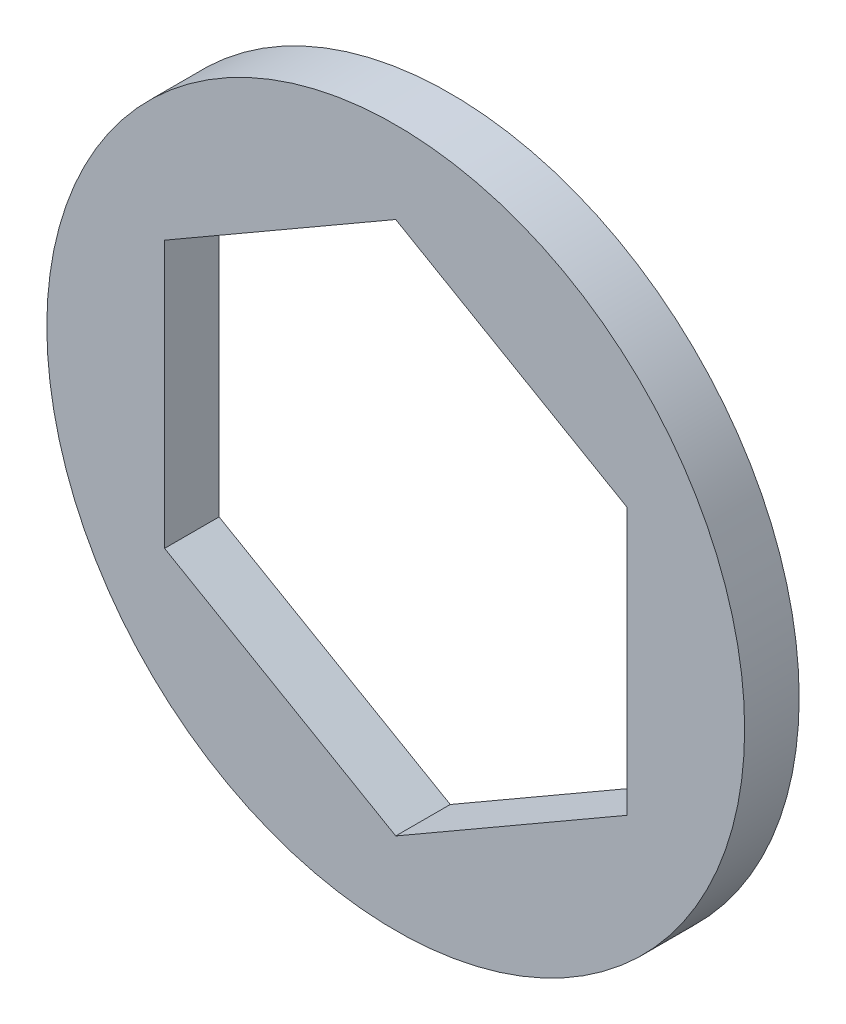
ISO-10303-21;
HEADER;
FILE_DESCRIPTION(('STEP AP214'),'2;1');
FILE_NAME('part.step','',(''),(''),'','','');
FILE_SCHEMA(('AUTOMOTIVE_DESIGN { 1 0 10303 214 1 1 1 1 }'));
ENDSEC;
DATA;
#1=APPLICATION_CONTEXT('core data for automotive mechanical design processes');
#2=APPLICATION_PROTOCOL_DEFINITION('international standard','automotive_design',2000,#1);
#3=PRODUCT_CONTEXT('',#1,'mechanical');
#4=PRODUCT('Part','Part','',(#3));
#5=PRODUCT_RELATED_PRODUCT_CATEGORY('part','',(#4));
#6=PRODUCT_DEFINITION_FORMATION('','',#4);
#7=PRODUCT_DEFINITION_CONTEXT('part definition',#1,'design');
#8=PRODUCT_DEFINITION('design','',#6,#7);
#9=PRODUCT_DEFINITION_SHAPE('','',#8);
#10=(LENGTH_UNIT() NAMED_UNIT(*) SI_UNIT(.MILLI.,.METRE.));
#11=(NAMED_UNIT(*) PLANE_ANGLE_UNIT() SI_UNIT($,.RADIAN.));
#12=(NAMED_UNIT(*) SI_UNIT($,.STERADIAN.) SOLID_ANGLE_UNIT());
#13=UNCERTAINTY_MEASURE_WITH_UNIT(LENGTH_MEASURE(1.E-05),#10,'distance_accuracy_value','');
#14=(GEOMETRIC_REPRESENTATION_CONTEXT(3) GLOBAL_UNCERTAINTY_ASSIGNED_CONTEXT((#13)) GLOBAL_UNIT_ASSIGNED_CONTEXT((#10,
#11,#12)) REPRESENTATION_CONTEXT('',''));
#15=CARTESIAN_POINT('',(0.,0.,0.));
#16=DIRECTION('',(0.,0.,1.));
#17=DIRECTION('',(1.,0.,0.));
#18=AXIS2_PLACEMENT_3D('',#15,#16,#17);
#19=CARTESIAN_POINT('',(0.,0.,0.79375));
#20=DIRECTION('',(0.,0.,1.));
#21=DIRECTION('',(1.,0.,0.));
#22=AXIS2_PLACEMENT_3D('',#19,#20,#21);
#23=PLANE('',#22);
#24=CARTESIAN_POINT('',(0.,0.,0.79375));
#25=DIRECTION('',(0.,0.,1.));
#26=DIRECTION('',(1.,0.,0.));
#27=AXIS2_PLACEMENT_3D('',#24,#25,#26);
#28=CIRCLE('',#27,10.16);
#29=CARTESIAN_POINT('',(10.16,0.,0.79375));
#30=VERTEX_POINT('',#29);
#31=EDGE_CURVE('E11',#30,#30,#28,.T.);
#32=ORIENTED_EDGE('',*,*,#31,.T.);
#33=EDGE_LOOP('',(#32));
#34=FACE_BOUND('',#33,.T.);
#35=DIRECTION('',(-0.866025403784438,-0.500000000000001,0.));
#36=VECTOR('',#35,1.);
#37=CARTESIAN_POINT('',(0.,7.77228932383074,0.79375));
#38=LINE('',#37,#36);
#39=CARTESIAN_POINT('',(0.,7.77228932383074,0.79375));
#40=VERTEX_POINT('',#39);
#41=CARTESIAN_POINT('',(-6.73100000000001,3.88614466191536,0.79375));
#42=VERTEX_POINT('',#41);
#43=EDGE_CURVE('E102',#40,#42,#38,.T.);
#44=ORIENTED_EDGE('',*,*,#43,.F.);
#45=DIRECTION('',(-0.866025403784441,0.499999999999995,0.));
#46=VECTOR('',#45,1.);
#47=CARTESIAN_POINT('',(6.73099999999995,3.88614466191545,0.79375));
#48=LINE('',#47,#46);
#49=CARTESIAN_POINT('',(6.73099999999995,3.88614466191545,0.79375));
#50=VERTEX_POINT('',#49);
#51=EDGE_CURVE('E94',#50,#40,#48,.T.);
#52=ORIENTED_EDGE('',*,*,#51,.F.);
#53=DIRECTION('',(0.,1.,0.));
#54=VECTOR('',#53,1.);
#55=CARTESIAN_POINT('',(6.73100000000004,-3.88614466191531,0.79375));
#56=LINE('',#55,#54);
#57=CARTESIAN_POINT('',(6.73100000000004,-3.88614466191531,0.79375));
#58=VERTEX_POINT('',#57);
#59=EDGE_CURVE('E122',#58,#50,#56,.T.);
#60=ORIENTED_EDGE('',*,*,#59,.F.);
#61=DIRECTION('',(0.866025403784435,0.500000000000007,0.));
#62=VECTOR('',#61,1.);
#63=CARTESIAN_POINT('',(0.,-7.77228932383074,0.79375));
#64=LINE('',#63,#62);
#65=CARTESIAN_POINT('',(0.,-7.77228932383074,0.79375));
#66=VERTEX_POINT('',#65);
#67=EDGE_CURVE('E120',#66,#58,#64,.T.);
#68=ORIENTED_EDGE('',*,*,#67,.F.);
#69=DIRECTION('',(0.866025403784441,-0.499999999999995,0.));
#70=VECTOR('',#69,1.);
#71=CARTESIAN_POINT('',(-6.73099999999998,-3.8861446619154,0.79375));
#72=LINE('',#71,#70);
#73=CARTESIAN_POINT('',(-6.73099999999998,-3.8861446619154,0.79375));
#74=VERTEX_POINT('',#73);
#75=EDGE_CURVE('E116',#74,#66,#72,.T.);
#76=ORIENTED_EDGE('',*,*,#75,.F.);
#77=DIRECTION('',(0.,-1.,0.));
#78=VECTOR('',#77,1.);
#79=CARTESIAN_POINT('',(-6.73100000000001,3.88614466191536,0.79375));
#80=LINE('',#79,#78);
#81=EDGE_CURVE('E114',#42,#74,#80,.T.);
#82=ORIENTED_EDGE('',*,*,#81,.F.);
#83=EDGE_LOOP('',(#44,#52,#60,#68,#76,#82));
#84=FACE_BOUND('',#83,.T.);
#85=ADVANCED_FACE('F41',(#34,#84),#23,.T.);
#86=CARTESIAN_POINT('',(0.,0.,-0.79375));
#87=DIRECTION('',(0.,0.,1.));
#88=DIRECTION('',(1.,0.,0.));
#89=AXIS2_PLACEMENT_3D('',#86,#87,#88);
#90=PLANE('',#89);
#91=CARTESIAN_POINT('',(0.,0.,-0.79375));
#92=DIRECTION('',(0.,0.,1.));
#93=DIRECTION('',(1.,0.,0.));
#94=AXIS2_PLACEMENT_3D('',#91,#92,#93);
#95=CIRCLE('',#94,10.16);
#96=CARTESIAN_POINT('',(10.16,0.,-0.79375));
#97=VERTEX_POINT('',#96);
#98=EDGE_CURVE('E45',#97,#97,#95,.T.);
#99=ORIENTED_EDGE('',*,*,#98,.F.);
#100=EDGE_LOOP('',(#99));
#101=FACE_BOUND('',#100,.T.);
#102=DIRECTION('',(-0.866025403784441,0.499999999999995,0.));
#103=VECTOR('',#102,1.);
#104=CARTESIAN_POINT('',(6.73099999999995,3.88614466191545,-0.79375));
#105=LINE('',#104,#103);
#106=CARTESIAN_POINT('',(6.73099999999995,3.88614466191545,-0.79375));
#107=VERTEX_POINT('',#106);
#108=CARTESIAN_POINT('',(0.,7.77228932383074,-0.79375));
#109=VERTEX_POINT('',#108);
#110=EDGE_CURVE('E64',#107,#109,#105,.T.);
#111=ORIENTED_EDGE('',*,*,#110,.T.);
#112=DIRECTION('',(-0.866025403784438,-0.500000000000001,0.));
#113=VECTOR('',#112,1.);
#114=CARTESIAN_POINT('',(0.,7.77228932383074,-0.79375));
#115=LINE('',#114,#113);
#116=CARTESIAN_POINT('',(-6.73100000000001,3.88614466191536,-0.79375));
#117=VERTEX_POINT('',#116);
#118=EDGE_CURVE('E109',#109,#117,#115,.T.);
#119=ORIENTED_EDGE('',*,*,#118,.T.);
#120=DIRECTION('',(0.,-1.,0.));
#121=VECTOR('',#120,1.);
#122=CARTESIAN_POINT('',(-6.73100000000001,3.88614466191536,-0.79375));
#123=LINE('',#122,#121);
#124=CARTESIAN_POINT('',(-6.73099999999998,-3.8861446619154,-0.79375));
#125=VERTEX_POINT('',#124);
#126=EDGE_CURVE('E126',#117,#125,#123,.T.);
#127=ORIENTED_EDGE('',*,*,#126,.T.);
#128=DIRECTION('',(0.866025403784441,-0.499999999999995,0.));
#129=VECTOR('',#128,1.);
#130=CARTESIAN_POINT('',(-6.73099999999998,-3.8861446619154,-0.79375));
#131=LINE('',#130,#129);
#132=CARTESIAN_POINT('',(0.,-7.77228932383074,-0.79375));
#133=VERTEX_POINT('',#132);
#134=EDGE_CURVE('E129',#125,#133,#131,.T.);
#135=ORIENTED_EDGE('',*,*,#134,.T.);
#136=DIRECTION('',(0.866025403784435,0.500000000000007,0.));
#137=VECTOR('',#136,1.);
#138=CARTESIAN_POINT('',(0.,-7.77228932383074,-0.79375));
#139=LINE('',#138,#137);
#140=CARTESIAN_POINT('',(6.73100000000004,-3.88614466191531,-0.79375));
#141=VERTEX_POINT('',#140);
#142=EDGE_CURVE('E132',#133,#141,#139,.T.);
#143=ORIENTED_EDGE('',*,*,#142,.T.);
#144=DIRECTION('',(0.,1.,0.));
#145=VECTOR('',#144,1.);
#146=CARTESIAN_POINT('',(6.73100000000004,-3.88614466191531,-0.79375));
#147=LINE('',#146,#145);
#148=EDGE_CURVE('E103',#141,#107,#147,.T.);
#149=ORIENTED_EDGE('',*,*,#148,.T.);
#150=EDGE_LOOP('',(#111,#119,#127,#135,#143,#149));
#151=FACE_BOUND('',#150,.T.);
#152=ADVANCED_FACE('F149',(#101,#151),#90,.F.);
#153=CARTESIAN_POINT('',(0.,0.,0.79375));
#154=DIRECTION('',(0.,0.,-1.));
#155=DIRECTION('',(-1.,0.,0.));
#156=AXIS2_PLACEMENT_3D('',#153,#154,#155);
#157=CYLINDRICAL_SURFACE('',#156,10.16);
#158=ORIENTED_EDGE('',*,*,#31,.F.);
#159=EDGE_LOOP('',(#158));
#160=FACE_BOUND('',#159,.T.);
#161=ORIENTED_EDGE('',*,*,#98,.T.);
#162=EDGE_LOOP('',(#161));
#163=FACE_BOUND('',#162,.T.);
#164=ADVANCED_FACE('F43',(#160,#163),#157,.T.);
#165=CARTESIAN_POINT('',(6.73099999999995,3.88614466191545,0.79375));
#166=DIRECTION('',(-0.499999999999995,-0.866025403784441,0.));
#167=DIRECTION('',(0.866025403784441,-0.499999999999995,0.));
#168=AXIS2_PLACEMENT_3D('',#165,#166,#167);
#169=PLANE('',#168);
#170=ORIENTED_EDGE('',*,*,#110,.F.);
#171=DIRECTION('',(0.,0.,-1.));
#172=VECTOR('',#171,1.);
#173=CARTESIAN_POINT('',(6.73099999999995,3.88614466191545,0.79375));
#174=LINE('',#173,#172);
#175=EDGE_CURVE('E98',#50,#107,#174,.T.);
#176=ORIENTED_EDGE('',*,*,#175,.F.);
#177=ORIENTED_EDGE('',*,*,#51,.T.);
#178=DIRECTION('',(0.,0.,-1.));
#179=VECTOR('',#178,1.);
#180=CARTESIAN_POINT('',(0.,7.77228932383074,0.79375));
#181=LINE('',#180,#179);
#182=EDGE_CURVE('E97',#40,#109,#181,.T.);
#183=ORIENTED_EDGE('',*,*,#182,.T.);
#184=EDGE_LOOP('',(#170,#176,#177,#183));
#185=FACE_BOUND('',#184,.T.);
#186=ADVANCED_FACE('F96',(#185),#169,.T.);
#187=CARTESIAN_POINT('',(0.,7.77228932383074,0.79375));
#188=DIRECTION('',(0.500000000000001,-0.866025403784438,0.));
#189=DIRECTION('',(0.866025403784438,0.500000000000001,0.));
#190=AXIS2_PLACEMENT_3D('',#187,#188,#189);
#191=PLANE('',#190);
#192=ORIENTED_EDGE('',*,*,#118,.F.);
#193=ORIENTED_EDGE('',*,*,#182,.F.);
#194=ORIENTED_EDGE('',*,*,#43,.T.);
#195=DIRECTION('',(0.,0.,-1.));
#196=VECTOR('',#195,1.);
#197=CARTESIAN_POINT('',(-6.73100000000001,3.88614466191536,0.79375));
#198=LINE('',#197,#196);
#199=EDGE_CURVE('E110',#42,#117,#198,.T.);
#200=ORIENTED_EDGE('',*,*,#199,.T.);
#201=EDGE_LOOP('',(#192,#193,#194,#200));
#202=FACE_BOUND('',#201,.T.);
#203=ADVANCED_FACE('F106',(#202),#191,.T.);
#204=CARTESIAN_POINT('',(-6.73100000000001,3.88614466191536,0.79375));
#205=DIRECTION('',(1.,0.,0.));
#206=DIRECTION('',(0.,1.,0.));
#207=AXIS2_PLACEMENT_3D('',#204,#205,#206);
#208=PLANE('',#207);
#209=ORIENTED_EDGE('',*,*,#126,.F.);
#210=ORIENTED_EDGE('',*,*,#199,.F.);
#211=ORIENTED_EDGE('',*,*,#81,.T.);
#212=DIRECTION('',(0.,0.,-1.));
#213=VECTOR('',#212,1.);
#214=CARTESIAN_POINT('',(-6.73099999999998,-3.8861446619154,0.79375));
#215=LINE('',#214,#213);
#216=EDGE_CURVE('E141',#74,#125,#215,.T.);
#217=ORIENTED_EDGE('',*,*,#216,.T.);
#218=EDGE_LOOP('',(#209,#210,#211,#217));
#219=FACE_BOUND('',#218,.T.);
#220=ADVANCED_FACE('F145',(#219),#208,.T.);
#221=CARTESIAN_POINT('',(-6.73099999999998,-3.8861446619154,0.79375));
#222=DIRECTION('',(0.499999999999995,0.866025403784442,0.));
#223=DIRECTION('',(-0.866025403784442,0.499999999999995,0.));
#224=AXIS2_PLACEMENT_3D('',#221,#222,#223);
#225=PLANE('',#224);
#226=ORIENTED_EDGE('',*,*,#134,.F.);
#227=ORIENTED_EDGE('',*,*,#216,.F.);
#228=ORIENTED_EDGE('',*,*,#75,.T.);
#229=DIRECTION('',(0.,0.,-1.));
#230=VECTOR('',#229,1.);
#231=CARTESIAN_POINT('',(0.,-7.77228932383074,0.79375));
#232=LINE('',#231,#230);
#233=EDGE_CURVE('E139',#66,#133,#232,.T.);
#234=ORIENTED_EDGE('',*,*,#233,.T.);
#235=EDGE_LOOP('',(#226,#227,#228,#234));
#236=FACE_BOUND('',#235,.T.);
#237=ADVANCED_FACE('F157',(#236),#225,.T.);
#238=CARTESIAN_POINT('',(0.,-7.77228932383074,0.79375));
#239=DIRECTION('',(-0.500000000000007,0.866025403784435,0.));
#240=DIRECTION('',(-0.866025403784435,-0.500000000000007,0.));
#241=AXIS2_PLACEMENT_3D('',#238,#239,#240);
#242=PLANE('',#241);
#243=ORIENTED_EDGE('',*,*,#142,.F.);
#244=ORIENTED_EDGE('',*,*,#233,.F.);
#245=ORIENTED_EDGE('',*,*,#67,.T.);
#246=DIRECTION('',(0.,0.,-1.));
#247=VECTOR('',#246,1.);
#248=CARTESIAN_POINT('',(6.73100000000004,-3.88614466191531,0.79375));
#249=LINE('',#248,#247);
#250=EDGE_CURVE('E56',#58,#141,#249,.T.);
#251=ORIENTED_EDGE('',*,*,#250,.T.);
#252=EDGE_LOOP('',(#243,#244,#245,#251));
#253=FACE_BOUND('',#252,.T.);
#254=ADVANCED_FACE('F155',(#253),#242,.T.);
#255=CARTESIAN_POINT('',(6.73100000000004,-3.88614466191531,0.79375));
#256=DIRECTION('',(-1.,0.,0.));
#257=DIRECTION('',(0.,-1.,0.));
#258=AXIS2_PLACEMENT_3D('',#255,#256,#257);
#259=PLANE('',#258);
#260=ORIENTED_EDGE('',*,*,#148,.F.);
#261=ORIENTED_EDGE('',*,*,#250,.F.);
#262=ORIENTED_EDGE('',*,*,#59,.T.);
#263=ORIENTED_EDGE('',*,*,#175,.T.);
#264=EDGE_LOOP('',(#260,#261,#262,#263));
#265=FACE_BOUND('',#264,.T.);
#266=ADVANCED_FACE('F151',(#265),#259,.T.);
#267=CLOSED_SHELL('',(#85,#152,#164,#186,#203,#220,#237,#254,#266));
#268=MANIFOLD_SOLID_BREP('B2',#267);
#269=ADVANCED_BREP_SHAPE_REPRESENTATION('',(#18,#268),#14);
#270=SHAPE_DEFINITION_REPRESENTATION(#9,#269);
ENDSEC;
END-ISO-10303-21;
